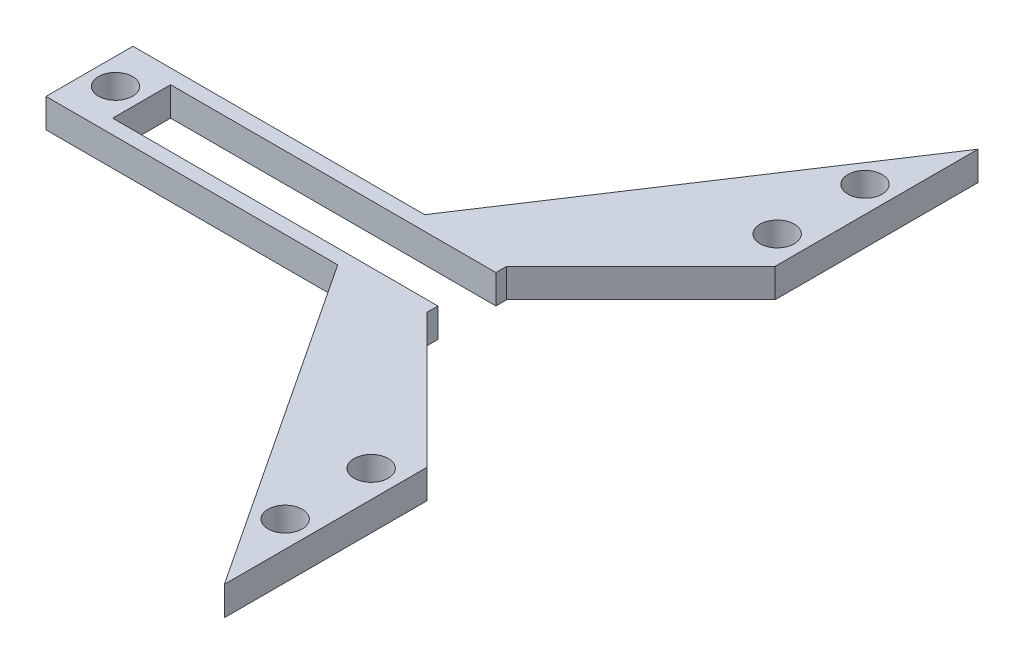
ISO-10303-21;
HEADER;
FILE_DESCRIPTION(('STEP AP214'),'2;1');
FILE_NAME('part.step','',(''),(''),'','','');
FILE_SCHEMA(('AUTOMOTIVE_DESIGN { 1 0 10303 214 1 1 1 1 }'));
ENDSEC;
DATA;
#1=APPLICATION_CONTEXT('core data for automotive mechanical design processes');
#2=APPLICATION_PROTOCOL_DEFINITION('international standard','automotive_design',2000,#1);
#3=PRODUCT_CONTEXT('',#1,'mechanical');
#4=PRODUCT('Part','Part','',(#3));
#5=PRODUCT_RELATED_PRODUCT_CATEGORY('part','',(#4));
#6=PRODUCT_DEFINITION_FORMATION('','',#4);
#7=PRODUCT_DEFINITION_CONTEXT('part definition',#1,'design');
#8=PRODUCT_DEFINITION('design','',#6,#7);
#9=PRODUCT_DEFINITION_SHAPE('','',#8);
#10=(LENGTH_UNIT() NAMED_UNIT(*) SI_UNIT(.MILLI.,.METRE.));
#11=(NAMED_UNIT(*) PLANE_ANGLE_UNIT() SI_UNIT($,.RADIAN.));
#12=(NAMED_UNIT(*) SI_UNIT($,.STERADIAN.) SOLID_ANGLE_UNIT());
#13=UNCERTAINTY_MEASURE_WITH_UNIT(LENGTH_MEASURE(1.E-05),#10,'distance_accuracy_value','');
#14=(GEOMETRIC_REPRESENTATION_CONTEXT(3) GLOBAL_UNCERTAINTY_ASSIGNED_CONTEXT((#13)) GLOBAL_UNIT_ASSIGNED_CONTEXT((#10,
#11,#12)) REPRESENTATION_CONTEXT('',''));
#15=CARTESIAN_POINT('',(0.,0.,0.));
#16=DIRECTION('',(0.,0.,1.));
#17=DIRECTION('',(1.,0.,0.));
#18=AXIS2_PLACEMENT_3D('',#15,#16,#17);
#19=CARTESIAN_POINT('',(3.22186842591949,2.54,0.949765093952835));
#20=DIRECTION('',(-1.,0.,0.));
#21=DIRECTION('',(0.,0.,1.));
#22=AXIS2_PLACEMENT_3D('',#19,#20,#21);
#23=PLANE('',#22);
#24=DIRECTION('',(0.,1.,0.));
#25=VECTOR('',#24,1.);
#26=CARTESIAN_POINT('',(3.22186842591949,0.,-5.08));
#27=LINE('',#26,#25);
#28=CARTESIAN_POINT('',(3.22186842591949,0.,-5.08));
#29=VERTEX_POINT('',#28);
#30=CARTESIAN_POINT('',(3.22186842591949,2.54,-5.08));
#31=VERTEX_POINT('',#30);
#32=EDGE_CURVE('E487',#29,#31,#27,.T.);
#33=ORIENTED_EDGE('',*,*,#32,.F.);
#34=DIRECTION('',(0.,0.,-1.));
#35=VECTOR('',#34,1.);
#36=CARTESIAN_POINT('',(3.22186842591949,0.,0.949765093952835));
#37=LINE('',#36,#35);
#38=CARTESIAN_POINT('',(3.22186842591949,0.,-6.02976509395282));
#39=VERTEX_POINT('',#38);
#40=EDGE_CURVE('E171',#29,#39,#37,.T.);
#41=ORIENTED_EDGE('',*,*,#40,.T.);
#42=DIRECTION('',(0.,-1.,0.));
#43=VECTOR('',#42,1.);
#44=CARTESIAN_POINT('',(3.22186842591949,2.54,-6.02976509395282));
#45=LINE('',#44,#43);
#46=CARTESIAN_POINT('',(3.22186842591949,2.54,-6.02976509395282));
#47=VERTEX_POINT('',#46);
#48=EDGE_CURVE('E199',#47,#39,#45,.T.);
#49=ORIENTED_EDGE('',*,*,#48,.F.);
#50=DIRECTION('',(0.,0.,-1.));
#51=VECTOR('',#50,1.);
#52=CARTESIAN_POINT('',(3.22186842591949,2.54,0.949765093952835));
#53=LINE('',#52,#51);
#54=EDGE_CURVE('E263',#31,#47,#53,.T.);
#55=ORIENTED_EDGE('',*,*,#54,.F.);
#56=EDGE_LOOP('',(#33,#41,#49,#55));
#57=FACE_BOUND('',#56,.T.);
#58=ADVANCED_FACE('F39',(#57),#23,.F.);
#59=CARTESIAN_POINT('',(-4.29581905287449,2.54,1.27));
#60=DIRECTION('',(0.834677390820566,0.,-0.550739188049092));
#61=DIRECTION('',(-0.550739188049092,0.,-0.834677390820566));
#62=AXIS2_PLACEMENT_3D('',#59,#60,#61);
#63=PLANE('',#62);
#64=DIRECTION('',(0.550739188049092,0.,0.834677390820566));
#65=VECTOR('',#64,1.);
#66=CARTESIAN_POINT('',(-4.29581905287449,0.,1.27));
#67=LINE('',#66,#65);
#68=CARTESIAN_POINT('',(-4.29581905287449,0.,1.27));
#69=VERTEX_POINT('',#68);
#70=CARTESIAN_POINT('',(14.9882776267843,0.,30.4961742948177));
#71=VERTEX_POINT('',#70);
#72=EDGE_CURVE('E163',#69,#71,#67,.T.);
#73=ORIENTED_EDGE('',*,*,#72,.T.);
#74=DIRECTION('',(0.,-1.,0.));
#75=VECTOR('',#74,1.);
#76=CARTESIAN_POINT('',(14.9882776267843,2.54,30.4961742948177));
#77=LINE('',#76,#75);
#78=CARTESIAN_POINT('',(14.9882776267843,2.54,30.4961742948177));
#79=VERTEX_POINT('',#78);
#80=EDGE_CURVE('E11',#79,#71,#77,.T.);
#81=ORIENTED_EDGE('',*,*,#80,.F.);
#82=DIRECTION('',(0.550739188049092,0.,0.834677390820566));
#83=VECTOR('',#82,1.);
#84=CARTESIAN_POINT('',(-4.29581905287449,2.54,1.27));
#85=LINE('',#84,#83);
#86=CARTESIAN_POINT('',(-4.29581905287449,2.54,1.27));
#87=VERTEX_POINT('',#86);
#88=EDGE_CURVE('E194',#87,#79,#85,.T.);
#89=ORIENTED_EDGE('',*,*,#88,.F.);
#90=DIRECTION('',(0.,-1.,0.));
#91=VECTOR('',#90,1.);
#92=CARTESIAN_POINT('',(-4.29581905287449,2.54,1.27));
#93=LINE('',#92,#91);
#94=EDGE_CURVE('E61',#87,#69,#93,.T.);
#95=ORIENTED_EDGE('',*,*,#94,.T.);
#96=EDGE_LOOP('',(#73,#81,#89,#95));
#97=FACE_BOUND('',#96,.T.);
#98=ADVANCED_FACE('F41',(#97),#63,.F.);
#99=CARTESIAN_POINT('',(14.9882776267843,2.54,30.4961742948177));
#100=DIRECTION('',(-1.,0.,0.));
#101=DIRECTION('',(0.,0.,1.));
#102=AXIS2_PLACEMENT_3D('',#99,#100,#101);
#103=PLANE('',#102);
#104=DIRECTION('',(0.,0.,-1.));
#105=VECTOR('',#104,1.);
#106=CARTESIAN_POINT('',(14.9882776267843,0.,30.4961742948177));
#107=LINE('',#106,#105);
#108=CARTESIAN_POINT('',(14.9882776267843,0.,12.7161742948177));
#109=VERTEX_POINT('',#108);
#110=EDGE_CURVE('E167',#71,#109,#107,.T.);
#111=ORIENTED_EDGE('',*,*,#110,.T.);
#112=DIRECTION('',(0.,-1.,0.));
#113=VECTOR('',#112,1.);
#114=CARTESIAN_POINT('',(14.9882776267843,2.54,12.7161742948177));
#115=LINE('',#114,#113);
#116=CARTESIAN_POINT('',(14.9882776267843,2.54,12.7161742948177));
#117=VERTEX_POINT('',#116);
#118=EDGE_CURVE('E50',#117,#109,#115,.T.);
#119=ORIENTED_EDGE('',*,*,#118,.F.);
#120=DIRECTION('',(0.,0.,-1.));
#121=VECTOR('',#120,1.);
#122=CARTESIAN_POINT('',(14.9882776267843,2.54,30.4961742948177));
#123=LINE('',#122,#121);
#124=EDGE_CURVE('E107',#79,#117,#123,.T.);
#125=ORIENTED_EDGE('',*,*,#124,.F.);
#126=ORIENTED_EDGE('',*,*,#80,.T.);
#127=EDGE_LOOP('',(#111,#119,#125,#126));
#128=FACE_BOUND('',#127,.T.);
#129=ADVANCED_FACE('F209',(#128),#103,.F.);
#130=CARTESIAN_POINT('',(3.22186842591949,2.54,0.949765093952835));
#131=DIRECTION('',(0.707106781186549,0.,-0.707106781186546));
#132=DIRECTION('',(-0.707106781186546,0.,-0.707106781186549));
#133=AXIS2_PLACEMENT_3D('',#130,#131,#132);
#134=PLANE('',#133);
#135=DIRECTION('',(0.707106781186546,0.,0.707106781186549));
#136=VECTOR('',#135,1.);
#137=CARTESIAN_POINT('',(3.22186842591949,0.,0.949765093952835));
#138=LINE('',#137,#136);
#139=CARTESIAN_POINT('',(3.22186842591949,0.,0.949765093952835));
#140=VERTEX_POINT('',#139);
#141=EDGE_CURVE('E168',#140,#109,#138,.T.);
#142=ORIENTED_EDGE('',*,*,#141,.F.);
#143=DIRECTION('',(0.,-1.,0.));
#144=VECTOR('',#143,1.);
#145=CARTESIAN_POINT('',(3.22186842591949,2.54,0.949765093952835));
#146=LINE('',#145,#144);
#147=CARTESIAN_POINT('',(3.22186842591949,2.54,0.949765093952835));
#148=VERTEX_POINT('',#147);
#149=EDGE_CURVE('E201',#148,#140,#146,.T.);
#150=ORIENTED_EDGE('',*,*,#149,.F.);
#151=DIRECTION('',(0.707106781186546,0.,0.707106781186549));
#152=VECTOR('',#151,1.);
#153=CARTESIAN_POINT('',(3.22186842591949,2.54,0.949765093952835));
#154=LINE('',#153,#152);
#155=EDGE_CURVE('E207',#148,#117,#154,.T.);
#156=ORIENTED_EDGE('',*,*,#155,.T.);
#157=ORIENTED_EDGE('',*,*,#118,.T.);
#158=EDGE_LOOP('',(#142,#150,#156,#157));
#159=FACE_BOUND('',#158,.T.);
#160=ADVANCED_FACE('F210',(#159),#134,.T.);
#161=CARTESIAN_POINT('',(3.22186842591949,0.,0.));
#162=VERTEX_POINT('',#161);
#163=EDGE_CURVE('E172',#140,#162,#37,.T.);
#164=ORIENTED_EDGE('',*,*,#163,.T.);
#165=DIRECTION('',(0.,1.,0.));
#166=VECTOR('',#165,1.);
#167=CARTESIAN_POINT('',(3.22186842591949,0.,0.));
#168=LINE('',#167,#166);
#169=CARTESIAN_POINT('',(3.22186842591949,2.54,0.));
#170=VERTEX_POINT('',#169);
#171=EDGE_CURVE('E230',#162,#170,#168,.T.);
#172=ORIENTED_EDGE('',*,*,#171,.T.);
#173=EDGE_CURVE('E262',#148,#170,#53,.T.);
#174=ORIENTED_EDGE('',*,*,#173,.F.);
#175=ORIENTED_EDGE('',*,*,#149,.T.);
#176=EDGE_LOOP('',(#164,#172,#174,#175));
#177=FACE_BOUND('',#176,.T.);
#178=ADVANCED_FACE('F221',(#177),#23,.F.);
#179=CARTESIAN_POINT('',(3.22186842591949,2.54,-6.02976509395282));
#180=DIRECTION('',(-0.707106781186549,0.,-0.707106781186546));
#181=DIRECTION('',(-0.707106781186546,0.,0.707106781186549));
#182=AXIS2_PLACEMENT_3D('',#179,#180,#181);
#183=PLANE('',#182);
#184=DIRECTION('',(0.707106781186546,0.,-0.707106781186549));
#185=VECTOR('',#184,1.);
#186=CARTESIAN_POINT('',(3.22186842591949,0.,-6.02976509395282));
#187=LINE('',#186,#185);
#188=CARTESIAN_POINT('',(14.9882776267843,0.,-17.7961742948177));
#189=VERTEX_POINT('',#188);
#190=EDGE_CURVE('E179',#39,#189,#187,.T.);
#191=ORIENTED_EDGE('',*,*,#190,.T.);
#192=DIRECTION('',(0.,-1.,0.));
#193=VECTOR('',#192,1.);
#194=CARTESIAN_POINT('',(14.9882776267843,2.54,-17.7961742948177));
#195=LINE('',#194,#193);
#196=CARTESIAN_POINT('',(14.9882776267843,2.54,-17.7961742948177));
#197=VERTEX_POINT('',#196);
#198=EDGE_CURVE('E196',#197,#189,#195,.T.);
#199=ORIENTED_EDGE('',*,*,#198,.F.);
#200=DIRECTION('',(0.707106781186546,0.,-0.707106781186549));
#201=VECTOR('',#200,1.);
#202=CARTESIAN_POINT('',(3.22186842591949,2.54,-6.02976509395282));
#203=LINE('',#202,#201);
#204=EDGE_CURVE('E266',#47,#197,#203,.T.);
#205=ORIENTED_EDGE('',*,*,#204,.F.);
#206=ORIENTED_EDGE('',*,*,#48,.T.);
#207=EDGE_LOOP('',(#191,#199,#205,#206));
#208=FACE_BOUND('',#207,.T.);
#209=ADVANCED_FACE('F290',(#208),#183,.F.);
#210=CARTESIAN_POINT('',(14.9882776267843,2.54,-35.5761742948177));
#211=DIRECTION('',(1.,0.,0.));
#212=DIRECTION('',(0.,0.,-1.));
#213=AXIS2_PLACEMENT_3D('',#210,#211,#212);
#214=PLANE('',#213);
#215=DIRECTION('',(0.,0.,1.));
#216=VECTOR('',#215,1.);
#217=CARTESIAN_POINT('',(14.9882776267843,0.,-35.5761742948177));
#218=LINE('',#217,#216);
#219=CARTESIAN_POINT('',(14.9882776267843,0.,-35.5761742948177));
#220=VERTEX_POINT('',#219);
#221=EDGE_CURVE('E176',#220,#189,#218,.T.);
#222=ORIENTED_EDGE('',*,*,#221,.F.);
#223=DIRECTION('',(0.,-1.,0.));
#224=VECTOR('',#223,1.);
#225=CARTESIAN_POINT('',(14.9882776267843,2.54,-35.5761742948177));
#226=LINE('',#225,#224);
#227=CARTESIAN_POINT('',(14.9882776267843,2.54,-35.5761742948177));
#228=VERTEX_POINT('',#227);
#229=EDGE_CURVE('E198',#228,#220,#226,.T.);
#230=ORIENTED_EDGE('',*,*,#229,.F.);
#231=DIRECTION('',(0.,0.,1.));
#232=VECTOR('',#231,1.);
#233=CARTESIAN_POINT('',(14.9882776267843,2.54,-35.5761742948177));
#234=LINE('',#233,#232);
#235=EDGE_CURVE('E268',#228,#197,#234,.T.);
#236=ORIENTED_EDGE('',*,*,#235,.T.);
#237=ORIENTED_EDGE('',*,*,#198,.T.);
#238=EDGE_LOOP('',(#222,#230,#236,#237));
#239=FACE_BOUND('',#238,.T.);
#240=ADVANCED_FACE('F294',(#239),#214,.T.);
#241=CARTESIAN_POINT('',(-4.29581905287449,2.54,-6.34999999999999));
#242=DIRECTION('',(-0.834677390820566,0.,-0.550739188049092));
#243=DIRECTION('',(-0.550739188049092,0.,0.834677390820566));
#244=AXIS2_PLACEMENT_3D('',#241,#242,#243);
#245=PLANE('',#244);
#246=DIRECTION('',(0.550739188049092,0.,-0.834677390820566));
#247=VECTOR('',#246,1.);
#248=CARTESIAN_POINT('',(-4.29581905287449,0.,-6.34999999999999));
#249=LINE('',#248,#247);
#250=CARTESIAN_POINT('',(-4.29581905287449,0.,-6.34999999999999));
#251=VERTEX_POINT('',#250);
#252=EDGE_CURVE('E181',#251,#220,#249,.T.);
#253=ORIENTED_EDGE('',*,*,#252,.F.);
#254=DIRECTION('',(0.,-1.,0.));
#255=VECTOR('',#254,1.);
#256=CARTESIAN_POINT('',(-4.29581905287449,2.54,-6.34999999999999));
#257=LINE('',#256,#255);
#258=CARTESIAN_POINT('',(-4.29581905287449,2.54,-6.34999999999999));
#259=VERTEX_POINT('',#258);
#260=EDGE_CURVE('E154',#259,#251,#257,.T.);
#261=ORIENTED_EDGE('',*,*,#260,.F.);
#262=DIRECTION('',(0.550739188049092,0.,-0.834677390820566));
#263=VECTOR('',#262,1.);
#264=CARTESIAN_POINT('',(-4.29581905287449,2.54,-6.34999999999999));
#265=LINE('',#264,#263);
#266=EDGE_CURVE('E145',#259,#228,#265,.T.);
#267=ORIENTED_EDGE('',*,*,#266,.T.);
#268=ORIENTED_EDGE('',*,*,#229,.T.);
#269=EDGE_LOOP('',(#253,#261,#267,#268));
#270=FACE_BOUND('',#269,.T.);
#271=ADVANCED_FACE('F275',(#270),#245,.T.);
#272=CARTESIAN_POINT('',(-4.29581905287449,2.54,-6.34999999999999));
#273=DIRECTION('',(0.,0.,1.));
#274=DIRECTION('',(1.,0.,0.));
#275=AXIS2_PLACEMENT_3D('',#272,#273,#274);
#276=PLANE('',#275);
#277=DIRECTION('',(-1.,0.,0.));
#278=VECTOR('',#277,1.);
#279=CARTESIAN_POINT('',(-4.29581905287449,0.,-6.34999999999999));
#280=LINE('',#279,#278);
#281=CARTESIAN_POINT('',(-29.8704,0.,-6.34999999999999));
#282=VERTEX_POINT('',#281);
#283=EDGE_CURVE('E151',#251,#282,#280,.T.);
#284=ORIENTED_EDGE('',*,*,#283,.T.);
#285=DIRECTION('',(0.,-1.,0.));
#286=VECTOR('',#285,1.);
#287=CARTESIAN_POINT('',(-29.8704,2.54,-6.34999999999999));
#288=LINE('',#287,#286);
#289=CARTESIAN_POINT('',(-29.8704,2.54,-6.34999999999999));
#290=VERTEX_POINT('',#289);
#291=EDGE_CURVE('E146',#290,#282,#288,.T.);
#292=ORIENTED_EDGE('',*,*,#291,.F.);
#293=DIRECTION('',(-1.,0.,0.));
#294=VECTOR('',#293,1.);
#295=CARTESIAN_POINT('',(-4.29581905287449,2.54,-6.34999999999999));
#296=LINE('',#295,#294);
#297=EDGE_CURVE('E132',#259,#290,#296,.T.);
#298=ORIENTED_EDGE('',*,*,#297,.F.);
#299=ORIENTED_EDGE('',*,*,#260,.T.);
#300=EDGE_LOOP('',(#284,#292,#298,#299));
#301=FACE_BOUND('',#300,.T.);
#302=ADVANCED_FACE('F149',(#301),#276,.F.);
#303=CARTESIAN_POINT('',(-29.8704,2.54,1.27000000000001));
#304=DIRECTION('',(-1.,0.,0.));
#305=DIRECTION('',(0.,0.,1.));
#306=AXIS2_PLACEMENT_3D('',#303,#304,#305);
#307=PLANE('',#306);
#308=DIRECTION('',(0.,0.,-1.));
#309=VECTOR('',#308,1.);
#310=CARTESIAN_POINT('',(-29.8704,0.,1.27000000000001));
#311=LINE('',#310,#309);
#312=CARTESIAN_POINT('',(-29.8704,0.,1.27000000000001));
#313=VERTEX_POINT('',#312);
#314=EDGE_CURVE('E190',#313,#282,#311,.T.);
#315=ORIENTED_EDGE('',*,*,#314,.F.);
#316=DIRECTION('',(0.,-1.,0.));
#317=VECTOR('',#316,1.);
#318=CARTESIAN_POINT('',(-29.8704,2.54,1.27000000000001));
#319=LINE('',#318,#317);
#320=CARTESIAN_POINT('',(-29.8704,2.54,1.27000000000001));
#321=VERTEX_POINT('',#320);
#322=EDGE_CURVE('E156',#321,#313,#319,.T.);
#323=ORIENTED_EDGE('',*,*,#322,.F.);
#324=DIRECTION('',(0.,0.,-1.));
#325=VECTOR('',#324,1.);
#326=CARTESIAN_POINT('',(-29.8704,2.54,1.27000000000001));
#327=LINE('',#326,#325);
#328=EDGE_CURVE('E143',#321,#290,#327,.T.);
#329=ORIENTED_EDGE('',*,*,#328,.T.);
#330=ORIENTED_EDGE('',*,*,#291,.T.);
#331=EDGE_LOOP('',(#315,#323,#329,#330));
#332=FACE_BOUND('',#331,.T.);
#333=ADVANCED_FACE('F158',(#332),#307,.T.);
#334=CARTESIAN_POINT('',(-4.29581905287449,2.54,1.27));
#335=DIRECTION('',(0.,0.,1.));
#336=DIRECTION('',(1.,0.,0.));
#337=AXIS2_PLACEMENT_3D('',#334,#335,#336);
#338=PLANE('',#337);
#339=DIRECTION('',(-1.,0.,0.));
#340=VECTOR('',#339,1.);
#341=CARTESIAN_POINT('',(-4.29581905287449,0.,1.27));
#342=LINE('',#341,#340);
#343=EDGE_CURVE('E187',#69,#313,#342,.T.);
#344=ORIENTED_EDGE('',*,*,#343,.F.);
#345=ORIENTED_EDGE('',*,*,#94,.F.);
#346=DIRECTION('',(-1.,0.,0.));
#347=VECTOR('',#346,1.);
#348=CARTESIAN_POINT('',(-4.29581905287449,2.54,1.27));
#349=LINE('',#348,#347);
#350=EDGE_CURVE('E157',#87,#321,#349,.T.);
#351=ORIENTED_EDGE('',*,*,#350,.T.);
#352=ORIENTED_EDGE('',*,*,#322,.T.);
#353=EDGE_LOOP('',(#344,#345,#351,#352));
#354=FACE_BOUND('',#353,.T.);
#355=ADVANCED_FACE('F273',(#354),#338,.T.);
#356=CARTESIAN_POINT('',(0.,2.54,0.));
#357=DIRECTION('',(0.,1.,0.));
#358=DIRECTION('',(0.,0.,1.));
#359=AXIS2_PLACEMENT_3D('',#356,#357,#358);
#360=PLANE('',#359);
#361=ORIENTED_EDGE('',*,*,#173,.T.);
#362=DIRECTION('',(1.,0.,0.));
#363=VECTOR('',#362,1.);
#364=CARTESIAN_POINT('',(0.101600000000001,2.54,0.));
#365=LINE('',#364,#363);
#366=CARTESIAN_POINT('',(-25.2984,2.54,0.));
#367=VERTEX_POINT('',#366);
#368=EDGE_CURVE('E258',#367,#170,#365,.T.);
#369=ORIENTED_EDGE('',*,*,#368,.F.);
#370=DIRECTION('',(0.,0.,1.));
#371=VECTOR('',#370,1.);
#372=CARTESIAN_POINT('',(-25.2984,2.54,-5.07999999999999));
#373=LINE('',#372,#371);
#374=CARTESIAN_POINT('',(-25.2984,2.54,-5.07999999999999));
#375=VERTEX_POINT('',#374);
#376=EDGE_CURVE('E53',#375,#367,#373,.T.);
#377=ORIENTED_EDGE('',*,*,#376,.F.);
#378=DIRECTION('',(-1.,0.,0.));
#379=VECTOR('',#378,1.);
#380=CARTESIAN_POINT('',(0.1016,2.54,-5.08));
#381=LINE('',#380,#379);
#382=EDGE_CURVE('E255',#31,#375,#381,.T.);
#383=ORIENTED_EDGE('',*,*,#382,.F.);
#384=ORIENTED_EDGE('',*,*,#54,.T.);
#385=ORIENTED_EDGE('',*,*,#204,.T.);
#386=ORIENTED_EDGE('',*,*,#235,.F.);
#387=ORIENTED_EDGE('',*,*,#266,.F.);
#388=ORIENTED_EDGE('',*,*,#297,.T.);
#389=ORIENTED_EDGE('',*,*,#328,.F.);
#390=ORIENTED_EDGE('',*,*,#350,.F.);
#391=ORIENTED_EDGE('',*,*,#88,.T.);
#392=ORIENTED_EDGE('',*,*,#124,.T.);
#393=ORIENTED_EDGE('',*,*,#155,.F.);
#394=EDGE_LOOP('',(#361,#369,#377,#383,#384,#385,#386,#387,#388,#389,#390,#391,#392,#393));
#395=FACE_BOUND('',#394,.T.);
#396=CARTESIAN_POINT('',(-27.5844,2.54,-2.53999999999999));
#397=DIRECTION('',(0.,1.,0.));
#398=DIRECTION('',(0.,0.,1.));
#399=AXIS2_PLACEMENT_3D('',#396,#397,#398);
#400=CIRCLE('',#399,1.4986);
#401=CARTESIAN_POINT('',(-27.5844,2.54,-1.04139999999999));
#402=VERTEX_POINT('',#401);
#403=EDGE_CURVE('E503',#402,#402,#400,.T.);
#404=ORIENTED_EDGE('',*,*,#403,.F.);
#405=EDGE_LOOP('',(#404));
#406=FACE_BOUND('',#405,.T.);
#407=CARTESIAN_POINT('',(12.7022776267843,2.54,-27.9561742948177));
#408=DIRECTION('',(0.,1.,0.));
#409=DIRECTION('',(0.,0.,1.));
#410=AXIS2_PLACEMENT_3D('',#407,#408,#409);
#411=CIRCLE('',#410,1.4986);
#412=CARTESIAN_POINT('',(12.7022776267843,2.54,-26.4575742948177));
#413=VERTEX_POINT('',#412);
#414=EDGE_CURVE('E502',#413,#413,#411,.T.);
#415=ORIENTED_EDGE('',*,*,#414,.F.);
#416=EDGE_LOOP('',(#415));
#417=FACE_BOUND('',#416,.T.);
#418=CARTESIAN_POINT('',(12.622030753034,2.54,-20.3365968498898));
#419=DIRECTION('',(0.,1.,0.));
#420=DIRECTION('',(0.,0.,1.));
#421=AXIS2_PLACEMENT_3D('',#418,#419,#420);
#422=CIRCLE('',#421,1.4986);
#423=CARTESIAN_POINT('',(12.622030753034,2.54,-18.8379968498898));
#424=VERTEX_POINT('',#423);
#425=EDGE_CURVE('E507',#424,#424,#422,.T.);
#426=ORIENTED_EDGE('',*,*,#425,.F.);
#427=EDGE_LOOP('',(#426));
#428=FACE_BOUND('',#427,.T.);
#429=CARTESIAN_POINT('',(12.622030753034,2.54,15.2565968498899));
#430=DIRECTION('',(0.,1.,0.));
#431=DIRECTION('',(0.,0.,-1.));
#432=AXIS2_PLACEMENT_3D('',#429,#430,#431);
#433=CIRCLE('',#432,1.4986);
#434=CARTESIAN_POINT('',(12.622030753034,2.54,13.7579968498899));
#435=VERTEX_POINT('',#434);
#436=EDGE_CURVE('E515',#435,#435,#433,.T.);
#437=ORIENTED_EDGE('',*,*,#436,.F.);
#438=EDGE_LOOP('',(#437));
#439=FACE_BOUND('',#438,.T.);
#440=CARTESIAN_POINT('',(12.7022776267843,2.54,22.8761742948177));
#441=DIRECTION('',(0.,1.,0.));
#442=DIRECTION('',(0.,0.,-1.));
#443=AXIS2_PLACEMENT_3D('',#440,#441,#442);
#444=CIRCLE('',#443,1.4986);
#445=CARTESIAN_POINT('',(12.7022776267843,2.54,21.3775742948177));
#446=VERTEX_POINT('',#445);
#447=EDGE_CURVE('E485',#446,#446,#444,.T.);
#448=ORIENTED_EDGE('',*,*,#447,.F.);
#449=EDGE_LOOP('',(#448));
#450=FACE_BOUND('',#449,.T.);
#451=ADVANCED_FACE('F139',(#395,#406,#417,#428,#439,#450),#360,.T.);
#452=CARTESIAN_POINT('',(0.,0.,0.));
#453=DIRECTION('',(0.,1.,0.));
#454=DIRECTION('',(0.,0.,1.));
#455=AXIS2_PLACEMENT_3D('',#452,#453,#454);
#456=PLANE('',#455);
#457=CARTESIAN_POINT('',(-27.5844,0.,-2.53999999999999));
#458=DIRECTION('',(0.,1.,0.));
#459=DIRECTION('',(0.,0.,1.));
#460=AXIS2_PLACEMENT_3D('',#457,#458,#459);
#461=CIRCLE('',#460,1.4986);
#462=CARTESIAN_POINT('',(-27.5844,0.,-1.04139999999999));
#463=VERTEX_POINT('',#462);
#464=EDGE_CURVE('E170',#463,#463,#461,.T.);
#465=ORIENTED_EDGE('',*,*,#464,.T.);
#466=EDGE_LOOP('',(#465));
#467=FACE_BOUND('',#466,.T.);
#468=CARTESIAN_POINT('',(12.7022776267843,0.,-27.9561742948177));
#469=DIRECTION('',(0.,1.,0.));
#470=DIRECTION('',(0.,0.,1.));
#471=AXIS2_PLACEMENT_3D('',#468,#469,#470);
#472=CIRCLE('',#471,1.4986);
#473=CARTESIAN_POINT('',(12.7022776267843,0.,-26.4575742948177));
#474=VERTEX_POINT('',#473);
#475=EDGE_CURVE('E466',#474,#474,#472,.T.);
#476=ORIENTED_EDGE('',*,*,#475,.T.);
#477=EDGE_LOOP('',(#476));
#478=FACE_BOUND('',#477,.T.);
#479=CARTESIAN_POINT('',(12.622030753034,0.,-20.3365968498898));
#480=DIRECTION('',(0.,1.,0.));
#481=DIRECTION('',(0.,0.,1.));
#482=AXIS2_PLACEMENT_3D('',#479,#480,#481);
#483=CIRCLE('',#482,1.4986);
#484=CARTESIAN_POINT('',(12.622030753034,0.,-18.8379968498898));
#485=VERTEX_POINT('',#484);
#486=EDGE_CURVE('E475',#485,#485,#483,.T.);
#487=ORIENTED_EDGE('',*,*,#486,.T.);
#488=EDGE_LOOP('',(#487));
#489=FACE_BOUND('',#488,.T.);
#490=CARTESIAN_POINT('',(12.622030753034,0.,15.2565968498899));
#491=DIRECTION('',(0.,1.,0.));
#492=DIRECTION('',(0.,0.,-1.));
#493=AXIS2_PLACEMENT_3D('',#490,#491,#492);
#494=CIRCLE('',#493,1.4986);
#495=CARTESIAN_POINT('',(12.622030753034,0.,13.7579968498899));
#496=VERTEX_POINT('',#495);
#497=EDGE_CURVE('E476',#496,#496,#494,.T.);
#498=ORIENTED_EDGE('',*,*,#497,.T.);
#499=EDGE_LOOP('',(#498));
#500=FACE_BOUND('',#499,.T.);
#501=CARTESIAN_POINT('',(12.7022776267843,0.,22.8761742948177));
#502=DIRECTION('',(0.,1.,0.));
#503=DIRECTION('',(0.,0.,-1.));
#504=AXIS2_PLACEMENT_3D('',#501,#502,#503);
#505=CIRCLE('',#504,1.4986);
#506=CARTESIAN_POINT('',(12.7022776267843,0.,21.3775742948177));
#507=VERTEX_POINT('',#506);
#508=EDGE_CURVE('E481',#507,#507,#505,.T.);
#509=ORIENTED_EDGE('',*,*,#508,.T.);
#510=EDGE_LOOP('',(#509));
#511=FACE_BOUND('',#510,.T.);
#512=ORIENTED_EDGE('',*,*,#40,.F.);
#513=DIRECTION('',(-1.,0.,0.));
#514=VECTOR('',#513,1.);
#515=CARTESIAN_POINT('',(0.1016,0.,-5.08));
#516=LINE('',#515,#514);
#517=CARTESIAN_POINT('',(-25.2984,0.,-5.07999999999999));
#518=VERTEX_POINT('',#517);
#519=EDGE_CURVE('E246',#29,#518,#516,.T.);
#520=ORIENTED_EDGE('',*,*,#519,.T.);
#521=DIRECTION('',(0.,0.,1.));
#522=VECTOR('',#521,1.);
#523=CARTESIAN_POINT('',(-25.2984,0.,-5.07999999999999));
#524=LINE('',#523,#522);
#525=CARTESIAN_POINT('',(-25.2984,0.,0.));
#526=VERTEX_POINT('',#525);
#527=EDGE_CURVE('E248',#518,#526,#524,.T.);
#528=ORIENTED_EDGE('',*,*,#527,.T.);
#529=DIRECTION('',(1.,0.,0.));
#530=VECTOR('',#529,1.);
#531=CARTESIAN_POINT('',(0.101600000000001,0.,0.));
#532=LINE('',#531,#530);
#533=EDGE_CURVE('E219',#526,#162,#532,.T.);
#534=ORIENTED_EDGE('',*,*,#533,.T.);
#535=ORIENTED_EDGE('',*,*,#163,.F.);
#536=ORIENTED_EDGE('',*,*,#141,.T.);
#537=ORIENTED_EDGE('',*,*,#110,.F.);
#538=ORIENTED_EDGE('',*,*,#72,.F.);
#539=ORIENTED_EDGE('',*,*,#343,.T.);
#540=ORIENTED_EDGE('',*,*,#314,.T.);
#541=ORIENTED_EDGE('',*,*,#283,.F.);
#542=ORIENTED_EDGE('',*,*,#252,.T.);
#543=ORIENTED_EDGE('',*,*,#221,.T.);
#544=ORIENTED_EDGE('',*,*,#190,.F.);
#545=EDGE_LOOP('',(#512,#520,#528,#534,#535,#536,#537,#538,#539,#540,#541,#542,#543,#544));
#546=FACE_BOUND('',#545,.T.);
#547=ADVANCED_FACE('F214',(#467,#478,#489,#500,#511,#546),#456,.F.);
#548=CARTESIAN_POINT('',(-25.2984,0.,-5.07999999999999));
#549=DIRECTION('',(-1.,0.,0.));
#550=DIRECTION('',(0.,0.,1.));
#551=AXIS2_PLACEMENT_3D('',#548,#549,#550);
#552=PLANE('',#551);
#553=ORIENTED_EDGE('',*,*,#376,.T.);
#554=DIRECTION('',(0.,1.,0.));
#555=VECTOR('',#554,1.);
#556=CARTESIAN_POINT('',(-25.2984,0.,0.));
#557=LINE('',#556,#555);
#558=EDGE_CURVE('E242',#526,#367,#557,.T.);
#559=ORIENTED_EDGE('',*,*,#558,.F.);
#560=ORIENTED_EDGE('',*,*,#527,.F.);
#561=DIRECTION('',(0.,1.,0.));
#562=VECTOR('',#561,1.);
#563=CARTESIAN_POINT('',(-25.2984,0.,-5.07999999999999));
#564=LINE('',#563,#562);
#565=EDGE_CURVE('E245',#518,#375,#564,.T.);
#566=ORIENTED_EDGE('',*,*,#565,.T.);
#567=EDGE_LOOP('',(#553,#559,#560,#566));
#568=FACE_BOUND('',#567,.T.);
#569=ADVANCED_FACE('F244',(#568),#552,.F.);
#570=CARTESIAN_POINT('',(0.1016,0.,-5.08));
#571=DIRECTION('',(0.,0.,-1.));
#572=DIRECTION('',(-1.,0.,0.));
#573=AXIS2_PLACEMENT_3D('',#570,#571,#572);
#574=PLANE('',#573);
#575=ORIENTED_EDGE('',*,*,#382,.T.);
#576=ORIENTED_EDGE('',*,*,#565,.F.);
#577=ORIENTED_EDGE('',*,*,#519,.F.);
#578=ORIENTED_EDGE('',*,*,#32,.T.);
#579=EDGE_LOOP('',(#575,#576,#577,#578));
#580=FACE_BOUND('',#579,.T.);
#581=ADVANCED_FACE('F348',(#580),#574,.F.);
#582=CARTESIAN_POINT('',(0.101600000000001,0.,0.));
#583=DIRECTION('',(0.,0.,1.));
#584=DIRECTION('',(1.,0.,0.));
#585=AXIS2_PLACEMENT_3D('',#582,#583,#584);
#586=PLANE('',#585);
#587=ORIENTED_EDGE('',*,*,#171,.F.);
#588=ORIENTED_EDGE('',*,*,#533,.F.);
#589=ORIENTED_EDGE('',*,*,#558,.T.);
#590=ORIENTED_EDGE('',*,*,#368,.T.);
#591=EDGE_LOOP('',(#587,#588,#589,#590));
#592=FACE_BOUND('',#591,.T.);
#593=ADVANCED_FACE('F252',(#592),#586,.F.);
#594=CARTESIAN_POINT('',(12.7022776267843,0.,22.8761742948177));
#595=DIRECTION('',(0.,1.,0.));
#596=DIRECTION('',(0.,0.,1.));
#597=AXIS2_PLACEMENT_3D('',#594,#595,#596);
#598=CYLINDRICAL_SURFACE('',#597,1.4986);
#599=ORIENTED_EDGE('',*,*,#508,.F.);
#600=EDGE_LOOP('',(#599));
#601=FACE_BOUND('',#600,.T.);
#602=ORIENTED_EDGE('',*,*,#447,.T.);
#603=EDGE_LOOP('',(#602));
#604=FACE_BOUND('',#603,.T.);
#605=ADVANCED_FACE('F359',(#601,#604),#598,.F.);
#606=CARTESIAN_POINT('',(12.622030753034,0.,15.2565968498899));
#607=DIRECTION('',(0.,1.,0.));
#608=DIRECTION('',(0.,0.,1.));
#609=AXIS2_PLACEMENT_3D('',#606,#607,#608);
#610=CYLINDRICAL_SURFACE('',#609,1.4986);
#611=ORIENTED_EDGE('',*,*,#497,.F.);
#612=EDGE_LOOP('',(#611));
#613=FACE_BOUND('',#612,.T.);
#614=ORIENTED_EDGE('',*,*,#436,.T.);
#615=EDGE_LOOP('',(#614));
#616=FACE_BOUND('',#615,.T.);
#617=ADVANCED_FACE('F363',(#613,#616),#610,.F.);
#618=CARTESIAN_POINT('',(12.622030753034,0.,-20.3365968498898));
#619=DIRECTION('',(0.,1.,0.));
#620=DIRECTION('',(0.,0.,1.));
#621=AXIS2_PLACEMENT_3D('',#618,#619,#620);
#622=CYLINDRICAL_SURFACE('',#621,1.4986);
#623=ORIENTED_EDGE('',*,*,#486,.F.);
#624=EDGE_LOOP('',(#623));
#625=FACE_BOUND('',#624,.T.);
#626=ORIENTED_EDGE('',*,*,#425,.T.);
#627=EDGE_LOOP('',(#626));
#628=FACE_BOUND('',#627,.T.);
#629=ADVANCED_FACE('F371',(#625,#628),#622,.F.);
#630=CARTESIAN_POINT('',(12.7022776267843,0.,-27.9561742948177));
#631=DIRECTION('',(0.,1.,0.));
#632=DIRECTION('',(0.,0.,1.));
#633=AXIS2_PLACEMENT_3D('',#630,#631,#632);
#634=CYLINDRICAL_SURFACE('',#633,1.4986);
#635=ORIENTED_EDGE('',*,*,#475,.F.);
#636=EDGE_LOOP('',(#635));
#637=FACE_BOUND('',#636,.T.);
#638=ORIENTED_EDGE('',*,*,#414,.T.);
#639=EDGE_LOOP('',(#638));
#640=FACE_BOUND('',#639,.T.);
#641=ADVANCED_FACE('F379',(#637,#640),#634,.F.);
#642=CARTESIAN_POINT('',(-27.5844,0.,-2.53999999999999));
#643=DIRECTION('',(0.,1.,0.));
#644=DIRECTION('',(0.,0.,1.));
#645=AXIS2_PLACEMENT_3D('',#642,#643,#644);
#646=CYLINDRICAL_SURFACE('',#645,1.4986);
#647=ORIENTED_EDGE('',*,*,#464,.F.);
#648=EDGE_LOOP('',(#647));
#649=FACE_BOUND('',#648,.T.);
#650=ORIENTED_EDGE('',*,*,#403,.T.);
#651=EDGE_LOOP('',(#650));
#652=FACE_BOUND('',#651,.T.);
#653=ADVANCED_FACE('F389',(#649,#652),#646,.F.);
#654=CLOSED_SHELL('',(#58,#98,#129,#160,#178,#209,#240,#271,#302,#333,#355,#451,#547,#569,#581,
#593,#605,#617,#629,#641,#653));
#655=MANIFOLD_SOLID_BREP('B2',#654);
#656=ADVANCED_BREP_SHAPE_REPRESENTATION('',(#18,#655),#14);
#657=SHAPE_DEFINITION_REPRESENTATION(#9,#656);
ENDSEC;
END-ISO-10303-21;
